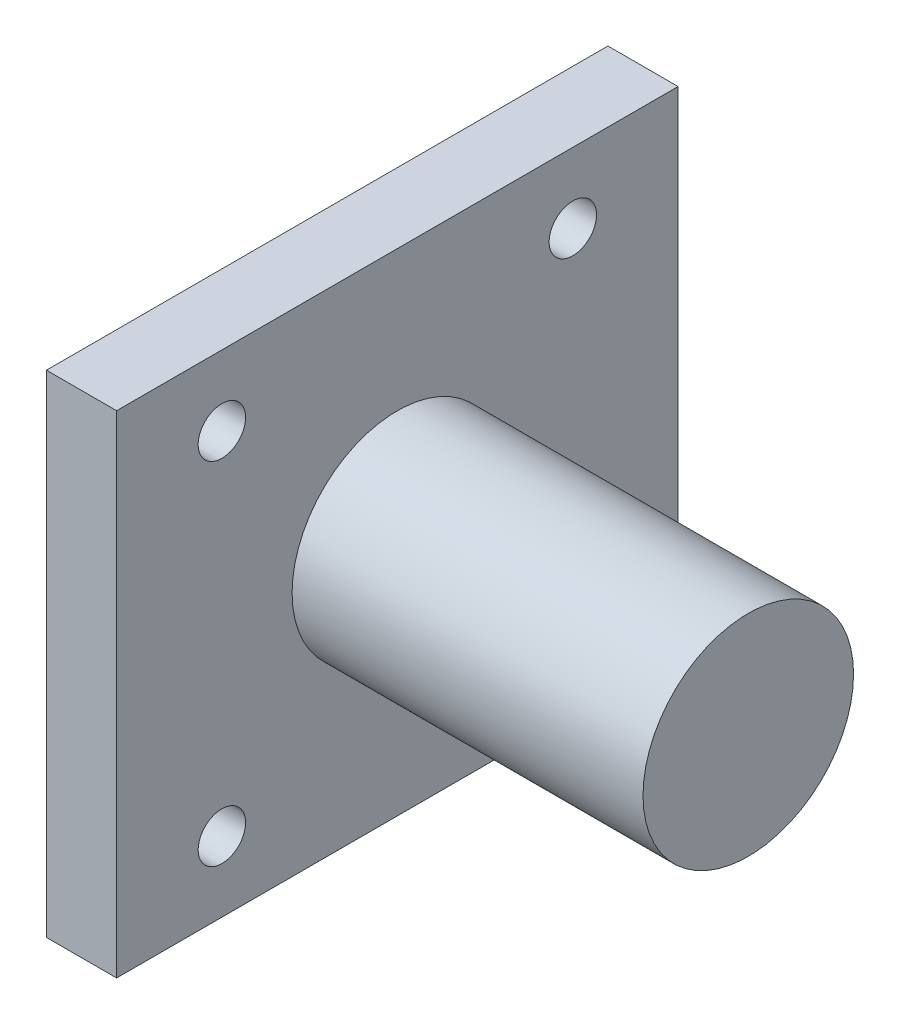
ISO-10303-21;
HEADER;
FILE_DESCRIPTION(('STEP AP214'),'2;1');
FILE_NAME('part.step','',(''),(''),'','','');
FILE_SCHEMA(('AUTOMOTIVE_DESIGN { 1 0 10303 214 1 1 1 1 }'));
ENDSEC;
DATA;
#1=APPLICATION_CONTEXT('core data for automotive mechanical design processes');
#2=APPLICATION_PROTOCOL_DEFINITION('international standard','automotive_design',2000,#1);
#3=PRODUCT_CONTEXT('',#1,'mechanical');
#4=PRODUCT('Part','Part','',(#3));
#5=PRODUCT_RELATED_PRODUCT_CATEGORY('part','',(#4));
#6=PRODUCT_DEFINITION_FORMATION('','',#4);
#7=PRODUCT_DEFINITION_CONTEXT('part definition',#1,'design');
#8=PRODUCT_DEFINITION('design','',#6,#7);
#9=PRODUCT_DEFINITION_SHAPE('','',#8);
#10=(LENGTH_UNIT() NAMED_UNIT(*) SI_UNIT(.MILLI.,.METRE.));
#11=(NAMED_UNIT(*) PLANE_ANGLE_UNIT() SI_UNIT($,.RADIAN.));
#12=(NAMED_UNIT(*) SI_UNIT($,.STERADIAN.) SOLID_ANGLE_UNIT());
#13=UNCERTAINTY_MEASURE_WITH_UNIT(LENGTH_MEASURE(1.E-05),#10,'distance_accuracy_value','');
#14=(GEOMETRIC_REPRESENTATION_CONTEXT(3) GLOBAL_UNCERTAINTY_ASSIGNED_CONTEXT((#13)) GLOBAL_UNIT_ASSIGNED_CONTEXT((#10,
#11,#12)) REPRESENTATION_CONTEXT('',''));
#15=CARTESIAN_POINT('',(0.,0.,0.));
#16=DIRECTION('',(0.,0.,1.));
#17=DIRECTION('',(1.,0.,0.));
#18=AXIS2_PLACEMENT_3D('',#15,#16,#17);
#19=CARTESIAN_POINT('',(10.0000000000002,34.9999999999998,-40.));
#20=DIRECTION('',(0.,0.,1.));
#21=DIRECTION('',(0.,-1.,0.));
#22=AXIS2_PLACEMENT_3D('',#19,#20,#21);
#23=PLANE('',#22);
#24=DIRECTION('',(0.,1.,0.));
#25=VECTOR('',#24,1.);
#26=CARTESIAN_POINT('',(0.,35.,-40.));
#27=LINE('',#26,#25);
#28=CARTESIAN_POINT('',(0.,-35.0000000000001,-40.));
#29=VERTEX_POINT('',#28);
#30=CARTESIAN_POINT('',(0.,35.,-40.));
#31=VERTEX_POINT('',#30);
#32=EDGE_CURVE('E102',#29,#31,#27,.T.);
#33=ORIENTED_EDGE('',*,*,#32,.T.);
#34=DIRECTION('',(-1.,0.,0.));
#35=VECTOR('',#34,1.);
#36=CARTESIAN_POINT('',(10.0000000000002,34.9999999999998,-40.));
#37=LINE('',#36,#35);
#38=CARTESIAN_POINT('',(10.0000000000002,34.9999999999998,-40.));
#39=VERTEX_POINT('',#38);
#40=EDGE_CURVE('E43',#39,#31,#37,.T.);
#41=ORIENTED_EDGE('',*,*,#40,.F.);
#42=DIRECTION('',(0.,1.,0.));
#43=VECTOR('',#42,1.);
#44=CARTESIAN_POINT('',(10.0000000000002,34.9999999999998,-40.));
#45=LINE('',#44,#43);
#46=CARTESIAN_POINT('',(9.99999999999999,-35.0000000000002,-40.));
#47=VERTEX_POINT('',#46);
#48=EDGE_CURVE('E88',#47,#39,#45,.T.);
#49=ORIENTED_EDGE('',*,*,#48,.F.);
#50=DIRECTION('',(-1.,0.,0.));
#51=VECTOR('',#50,1.);
#52=CARTESIAN_POINT('',(9.99999999999999,-35.0000000000002,-40.));
#53=LINE('',#52,#51);
#54=EDGE_CURVE('E98',#47,#29,#53,.T.);
#55=ORIENTED_EDGE('',*,*,#54,.T.);
#56=EDGE_LOOP('',(#33,#41,#49,#55));
#57=FACE_BOUND('',#56,.T.);
#58=ADVANCED_FACE('F34',(#57),#23,.F.);
#59=CARTESIAN_POINT('',(10.0000000000002,34.9999999999998,40.));
#60=DIRECTION('',(0.,-1.,0.));
#61=DIRECTION('',(0.,0.,-1.));
#62=AXIS2_PLACEMENT_3D('',#59,#60,#61);
#63=PLANE('',#62);
#64=DIRECTION('',(0.,0.,1.));
#65=VECTOR('',#64,1.);
#66=CARTESIAN_POINT('',(0.,35.,40.));
#67=LINE('',#66,#65);
#68=CARTESIAN_POINT('',(0.,35.,40.));
#69=VERTEX_POINT('',#68);
#70=EDGE_CURVE('E93',#31,#69,#67,.T.);
#71=ORIENTED_EDGE('',*,*,#70,.T.);
#72=DIRECTION('',(-1.,0.,0.));
#73=VECTOR('',#72,1.);
#74=CARTESIAN_POINT('',(10.0000000000002,34.9999999999998,40.));
#75=LINE('',#74,#73);
#76=CARTESIAN_POINT('',(10.0000000000002,34.9999999999998,40.));
#77=VERTEX_POINT('',#76);
#78=EDGE_CURVE('E91',#77,#69,#75,.T.);
#79=ORIENTED_EDGE('',*,*,#78,.F.);
#80=DIRECTION('',(0.,0.,1.));
#81=VECTOR('',#80,1.);
#82=CARTESIAN_POINT('',(10.0000000000002,34.9999999999998,40.));
#83=LINE('',#82,#81);
#84=EDGE_CURVE('E83',#39,#77,#83,.T.);
#85=ORIENTED_EDGE('',*,*,#84,.F.);
#86=ORIENTED_EDGE('',*,*,#40,.T.);
#87=EDGE_LOOP('',(#71,#79,#85,#86));
#88=FACE_BOUND('',#87,.T.);
#89=ADVANCED_FACE('F92',(#88),#63,.F.);
#90=CARTESIAN_POINT('',(10.0000000000002,34.9999999999998,40.));
#91=DIRECTION('',(0.,0.,-1.));
#92=DIRECTION('',(0.,1.,0.));
#93=AXIS2_PLACEMENT_3D('',#90,#91,#92);
#94=PLANE('',#93);
#95=DIRECTION('',(0.,-1.,0.));
#96=VECTOR('',#95,1.);
#97=CARTESIAN_POINT('',(0.,35.,40.));
#98=LINE('',#97,#96);
#99=CARTESIAN_POINT('',(0.,-35.0000000000001,40.));
#100=VERTEX_POINT('',#99);
#101=EDGE_CURVE('E69',#69,#100,#98,.T.);
#102=ORIENTED_EDGE('',*,*,#101,.T.);
#103=DIRECTION('',(-1.,0.,0.));
#104=VECTOR('',#103,1.);
#105=CARTESIAN_POINT('',(9.99999999999999,-35.0000000000002,40.));
#106=LINE('',#105,#104);
#107=CARTESIAN_POINT('',(9.99999999999999,-35.0000000000002,40.));
#108=VERTEX_POINT('',#107);
#109=EDGE_CURVE('E94',#108,#100,#106,.T.);
#110=ORIENTED_EDGE('',*,*,#109,.F.);
#111=DIRECTION('',(0.,-1.,0.));
#112=VECTOR('',#111,1.);
#113=CARTESIAN_POINT('',(10.0000000000002,34.9999999999998,40.));
#114=LINE('',#113,#112);
#115=EDGE_CURVE('E86',#77,#108,#114,.T.);
#116=ORIENTED_EDGE('',*,*,#115,.F.);
#117=ORIENTED_EDGE('',*,*,#78,.T.);
#118=EDGE_LOOP('',(#102,#110,#116,#117));
#119=FACE_BOUND('',#118,.T.);
#120=ADVANCED_FACE('F96',(#119),#94,.F.);
#121=CARTESIAN_POINT('',(9.99999999999999,-35.0000000000002,40.));
#122=DIRECTION('',(0.,1.,0.));
#123=DIRECTION('',(0.,0.,1.));
#124=AXIS2_PLACEMENT_3D('',#121,#122,#123);
#125=PLANE('',#124);
#126=DIRECTION('',(0.,0.,-1.));
#127=VECTOR('',#126,1.);
#128=CARTESIAN_POINT('',(0.,-35.0000000000001,40.));
#129=LINE('',#128,#127);
#130=EDGE_CURVE('E75',#100,#29,#129,.T.);
#131=ORIENTED_EDGE('',*,*,#130,.T.);
#132=ORIENTED_EDGE('',*,*,#54,.F.);
#133=DIRECTION('',(0.,0.,-1.));
#134=VECTOR('',#133,1.);
#135=CARTESIAN_POINT('',(9.99999999999999,-35.0000000000002,40.));
#136=LINE('',#135,#134);
#137=EDGE_CURVE('E52',#108,#47,#136,.T.);
#138=ORIENTED_EDGE('',*,*,#137,.F.);
#139=ORIENTED_EDGE('',*,*,#109,.T.);
#140=EDGE_LOOP('',(#131,#132,#138,#139));
#141=FACE_BOUND('',#140,.T.);
#142=ADVANCED_FACE('F124',(#141),#125,.F.);
#143=CARTESIAN_POINT('',(10.,0.,0.));
#144=DIRECTION('',(1.,0.,0.));
#145=DIRECTION('',(0.,0.,-1.));
#146=AXIS2_PLACEMENT_3D('',#143,#144,#145);
#147=PLANE('',#146);
#148=CARTESIAN_POINT('',(10.,-25.0000000000001,-25.));
#149=DIRECTION('',(1.,0.,0.));
#150=DIRECTION('',(0.,0.,-1.));
#151=AXIS2_PLACEMENT_3D('',#148,#149,#150);
#152=CIRCLE('',#151,3.3782);
#153=CARTESIAN_POINT('',(10.,-25.0000000000001,-28.3782));
#154=VERTEX_POINT('',#153);
#155=EDGE_CURVE('E212',#154,#154,#152,.T.);
#156=ORIENTED_EDGE('',*,*,#155,.F.);
#157=EDGE_LOOP('',(#156));
#158=FACE_BOUND('',#157,.T.);
#159=CARTESIAN_POINT('',(9.99999999999997,25.,-25.));
#160=DIRECTION('',(1.,0.,0.));
#161=DIRECTION('',(0.,0.,-1.));
#162=AXIS2_PLACEMENT_3D('',#159,#160,#161);
#163=CIRCLE('',#162,3.3782);
#164=CARTESIAN_POINT('',(9.99999999999997,25.,-28.3782));
#165=VERTEX_POINT('',#164);
#166=EDGE_CURVE('E215',#165,#165,#163,.T.);
#167=ORIENTED_EDGE('',*,*,#166,.F.);
#168=EDGE_LOOP('',(#167));
#169=FACE_BOUND('',#168,.T.);
#170=CARTESIAN_POINT('',(10.,-25.0000000000001,25.));
#171=DIRECTION('',(1.,0.,0.));
#172=DIRECTION('',(0.,0.,-1.));
#173=AXIS2_PLACEMENT_3D('',#170,#171,#172);
#174=CIRCLE('',#173,3.3782);
#175=CARTESIAN_POINT('',(10.,-25.0000000000001,21.6218));
#176=VERTEX_POINT('',#175);
#177=EDGE_CURVE('E224',#176,#176,#174,.T.);
#178=ORIENTED_EDGE('',*,*,#177,.F.);
#179=EDGE_LOOP('',(#178));
#180=FACE_BOUND('',#179,.T.);
#181=CARTESIAN_POINT('',(9.99999999999997,25.,25.));
#182=DIRECTION('',(1.,0.,0.));
#183=DIRECTION('',(0.,0.,-1.));
#184=AXIS2_PLACEMENT_3D('',#181,#182,#183);
#185=CIRCLE('',#184,3.3782);
#186=CARTESIAN_POINT('',(9.99999999999997,25.,21.6218));
#187=VERTEX_POINT('',#186);
#188=EDGE_CURVE('E230',#187,#187,#185,.T.);
#189=ORIENTED_EDGE('',*,*,#188,.F.);
#190=EDGE_LOOP('',(#189));
#191=FACE_BOUND('',#190,.T.);
#192=CARTESIAN_POINT('',(10.,0.,0.));
#193=DIRECTION('',(1.,0.,0.));
#194=DIRECTION('',(0.,0.,-1.));
#195=AXIS2_PLACEMENT_3D('',#192,#193,#194);
#196=CIRCLE('',#195,15.);
#197=CARTESIAN_POINT('',(10.,0.,-15.));
#198=VERTEX_POINT('',#197);
#199=EDGE_CURVE('E11',#198,#198,#196,.T.);
#200=ORIENTED_EDGE('',*,*,#199,.F.);
#201=EDGE_LOOP('',(#200));
#202=FACE_BOUND('',#201,.T.);
#203=ORIENTED_EDGE('',*,*,#48,.T.);
#204=ORIENTED_EDGE('',*,*,#84,.T.);
#205=ORIENTED_EDGE('',*,*,#115,.T.);
#206=ORIENTED_EDGE('',*,*,#137,.T.);
#207=EDGE_LOOP('',(#203,#204,#205,#206));
#208=FACE_BOUND('',#207,.T.);
#209=ADVANCED_FACE('F84',(#158,#169,#180,#191,#202,#208),#147,.T.);
#210=CARTESIAN_POINT('',(0.,0.,0.));
#211=DIRECTION('',(1.,0.,0.));
#212=DIRECTION('',(0.,0.,-1.));
#213=AXIS2_PLACEMENT_3D('',#210,#211,#212);
#214=PLANE('',#213);
#215=CARTESIAN_POINT('',(0.,-25.0000000000001,-25.));
#216=DIRECTION('',(1.,0.,0.));
#217=DIRECTION('',(0.,0.,-1.));
#218=AXIS2_PLACEMENT_3D('',#215,#216,#217);
#219=CIRCLE('',#218,3.3782);
#220=CARTESIAN_POINT('',(0.,-25.0000000000001,-28.3782));
#221=VERTEX_POINT('',#220);
#222=EDGE_CURVE('E214',#221,#221,#219,.T.);
#223=ORIENTED_EDGE('',*,*,#222,.T.);
#224=EDGE_LOOP('',(#223));
#225=FACE_BOUND('',#224,.T.);
#226=CARTESIAN_POINT('',(0.,25.,-25.));
#227=DIRECTION('',(1.,0.,0.));
#228=DIRECTION('',(0.,0.,-1.));
#229=AXIS2_PLACEMENT_3D('',#226,#227,#228);
#230=CIRCLE('',#229,3.3782);
#231=CARTESIAN_POINT('',(0.,25.,-28.3782));
#232=VERTEX_POINT('',#231);
#233=EDGE_CURVE('E218',#232,#232,#230,.T.);
#234=ORIENTED_EDGE('',*,*,#233,.T.);
#235=EDGE_LOOP('',(#234));
#236=FACE_BOUND('',#235,.T.);
#237=CARTESIAN_POINT('',(0.,-25.0000000000001,25.));
#238=DIRECTION('',(1.,0.,0.));
#239=DIRECTION('',(0.,0.,-1.));
#240=AXIS2_PLACEMENT_3D('',#237,#238,#239);
#241=CIRCLE('',#240,3.3782);
#242=CARTESIAN_POINT('',(0.,-25.0000000000001,21.6218));
#243=VERTEX_POINT('',#242);
#244=EDGE_CURVE('E227',#243,#243,#241,.T.);
#245=ORIENTED_EDGE('',*,*,#244,.T.);
#246=EDGE_LOOP('',(#245));
#247=FACE_BOUND('',#246,.T.);
#248=CARTESIAN_POINT('',(0.,25.,25.));
#249=DIRECTION('',(1.,0.,0.));
#250=DIRECTION('',(0.,0.,-1.));
#251=AXIS2_PLACEMENT_3D('',#248,#249,#250);
#252=CIRCLE('',#251,3.3782);
#253=CARTESIAN_POINT('',(0.,25.,21.6218));
#254=VERTEX_POINT('',#253);
#255=EDGE_CURVE('E233',#254,#254,#252,.T.);
#256=ORIENTED_EDGE('',*,*,#255,.T.);
#257=EDGE_LOOP('',(#256));
#258=FACE_BOUND('',#257,.T.);
#259=CARTESIAN_POINT('',(0.,0.,0.));
#260=DIRECTION('',(1.,0.,0.));
#261=DIRECTION('',(0.,0.,-1.));
#262=AXIS2_PLACEMENT_3D('',#259,#260,#261);
#263=CIRCLE('',#262,15.);
#264=CARTESIAN_POINT('',(0.,0.,-15.));
#265=VERTEX_POINT('',#264);
#266=EDGE_CURVE('E37',#265,#265,#263,.T.);
#267=ORIENTED_EDGE('',*,*,#266,.T.);
#268=EDGE_LOOP('',(#267));
#269=FACE_BOUND('',#268,.T.);
#270=ORIENTED_EDGE('',*,*,#32,.F.);
#271=ORIENTED_EDGE('',*,*,#130,.F.);
#272=ORIENTED_EDGE('',*,*,#101,.F.);
#273=ORIENTED_EDGE('',*,*,#70,.F.);
#274=EDGE_LOOP('',(#270,#271,#272,#273));
#275=FACE_BOUND('',#274,.T.);
#276=ADVANCED_FACE('F112',(#225,#236,#247,#258,#269,#275),#214,.F.);
#277=CARTESIAN_POINT('',(-15.,-1.11022302462516E-13,0.));
#278=DIRECTION('',(1.,0.,0.));
#279=DIRECTION('',(0.,0.,-1.));
#280=AXIS2_PLACEMENT_3D('',#277,#278,#279);
#281=PLANE('',#280);
#282=CARTESIAN_POINT('',(-15.,-1.11022302462516E-13,0.));
#283=DIRECTION('',(1.,0.,0.));
#284=DIRECTION('',(0.,0.,-1.));
#285=AXIS2_PLACEMENT_3D('',#282,#283,#284);
#286=CIRCLE('',#285,15.);
#287=CARTESIAN_POINT('',(-15.,-1.11022302462516E-13,-15.));
#288=VERTEX_POINT('',#287);
#289=EDGE_CURVE('E239',#288,#288,#286,.T.);
#290=ORIENTED_EDGE('',*,*,#289,.F.);
#291=EDGE_LOOP('',(#290));
#292=FACE_BOUND('',#291,.T.);
#293=ADVANCED_FACE('F114',(#292),#281,.F.);
#294=CARTESIAN_POINT('',(-15.,-1.11022302462516E-13,0.));
#295=DIRECTION('',(1.,0.,0.));
#296=DIRECTION('',(0.,0.,-1.));
#297=AXIS2_PLACEMENT_3D('',#294,#295,#296);
#298=CYLINDRICAL_SURFACE('',#297,15.);
#299=ORIENTED_EDGE('',*,*,#289,.T.);
#300=EDGE_LOOP('',(#299));
#301=FACE_BOUND('',#300,.T.);
#302=ORIENTED_EDGE('',*,*,#266,.F.);
#303=EDGE_LOOP('',(#302));
#304=FACE_BOUND('',#303,.T.);
#305=ADVANCED_FACE('F121',(#301,#304),#298,.T.);
#306=ORIENTED_EDGE('',*,*,#199,.T.);
#307=EDGE_LOOP('',(#306));
#308=FACE_BOUND('',#307,.T.);
#309=CARTESIAN_POINT('',(60.0000000000001,0.,0.));
#310=DIRECTION('',(1.,0.,0.));
#311=DIRECTION('',(0.,0.,-1.));
#312=AXIS2_PLACEMENT_3D('',#309,#310,#311);
#313=CIRCLE('',#312,15.);
#314=CARTESIAN_POINT('',(60.0000000000001,0.,-15.));
#315=VERTEX_POINT('',#314);
#316=EDGE_CURVE('E236',#315,#315,#313,.T.);
#317=ORIENTED_EDGE('',*,*,#316,.F.);
#318=EDGE_LOOP('',(#317));
#319=FACE_BOUND('',#318,.T.);
#320=ADVANCED_FACE('F160',(#308,#319),#298,.T.);
#321=CARTESIAN_POINT('',(60.0000000000001,0.,0.));
#322=DIRECTION('',(1.,0.,0.));
#323=DIRECTION('',(0.,0.,-1.));
#324=AXIS2_PLACEMENT_3D('',#321,#322,#323);
#325=PLANE('',#324);
#326=ORIENTED_EDGE('',*,*,#316,.T.);
#327=EDGE_LOOP('',(#326));
#328=FACE_BOUND('',#327,.T.);
#329=ADVANCED_FACE('F168',(#328),#325,.T.);
#330=CARTESIAN_POINT('',(9.99999999999997,25.,25.));
#331=DIRECTION('',(1.,0.,0.));
#332=DIRECTION('',(0.,0.,-1.));
#333=AXIS2_PLACEMENT_3D('',#330,#331,#332);
#334=CYLINDRICAL_SURFACE('',#333,3.3782);
#335=ORIENTED_EDGE('',*,*,#188,.T.);
#336=EDGE_LOOP('',(#335));
#337=FACE_BOUND('',#336,.T.);
#338=ORIENTED_EDGE('',*,*,#255,.F.);
#339=EDGE_LOOP('',(#338));
#340=FACE_BOUND('',#339,.T.);
#341=ADVANCED_FACE('F175',(#337,#340),#334,.F.);
#342=CARTESIAN_POINT('',(10.,-25.0000000000001,25.));
#343=DIRECTION('',(1.,0.,0.));
#344=DIRECTION('',(0.,0.,-1.));
#345=AXIS2_PLACEMENT_3D('',#342,#343,#344);
#346=CYLINDRICAL_SURFACE('',#345,3.3782);
#347=ORIENTED_EDGE('',*,*,#177,.T.);
#348=EDGE_LOOP('',(#347));
#349=FACE_BOUND('',#348,.T.);
#350=ORIENTED_EDGE('',*,*,#244,.F.);
#351=EDGE_LOOP('',(#350));
#352=FACE_BOUND('',#351,.T.);
#353=ADVANCED_FACE('F183',(#349,#352),#346,.F.);
#354=CARTESIAN_POINT('',(9.99999999999997,25.,-25.));
#355=DIRECTION('',(1.,0.,0.));
#356=DIRECTION('',(0.,0.,-1.));
#357=AXIS2_PLACEMENT_3D('',#354,#355,#356);
#358=CYLINDRICAL_SURFACE('',#357,3.3782);
#359=ORIENTED_EDGE('',*,*,#166,.T.);
#360=EDGE_LOOP('',(#359));
#361=FACE_BOUND('',#360,.T.);
#362=ORIENTED_EDGE('',*,*,#233,.F.);
#363=EDGE_LOOP('',(#362));
#364=FACE_BOUND('',#363,.T.);
#365=ADVANCED_FACE('F191',(#361,#364),#358,.F.);
#366=CARTESIAN_POINT('',(10.,-25.0000000000001,-25.));
#367=DIRECTION('',(1.,0.,0.));
#368=DIRECTION('',(0.,0.,-1.));
#369=AXIS2_PLACEMENT_3D('',#366,#367,#368);
#370=CYLINDRICAL_SURFACE('',#369,3.3782);
#371=ORIENTED_EDGE('',*,*,#155,.T.);
#372=EDGE_LOOP('',(#371));
#373=FACE_BOUND('',#372,.T.);
#374=ORIENTED_EDGE('',*,*,#222,.F.);
#375=EDGE_LOOP('',(#374));
#376=FACE_BOUND('',#375,.T.);
#377=ADVANCED_FACE('F199',(#373,#376),#370,.F.);
#378=CLOSED_SHELL('',(#58,#89,#120,#142,#209,#276,#293,#305,#320,#329,#341,#353,#365,#377));
#379=MANIFOLD_SOLID_BREP('B2',#378);
#380=ADVANCED_BREP_SHAPE_REPRESENTATION('',(#18,#379),#14);
#381=SHAPE_DEFINITION_REPRESENTATION(#9,#380);
ENDSEC;
END-ISO-10303-21;
